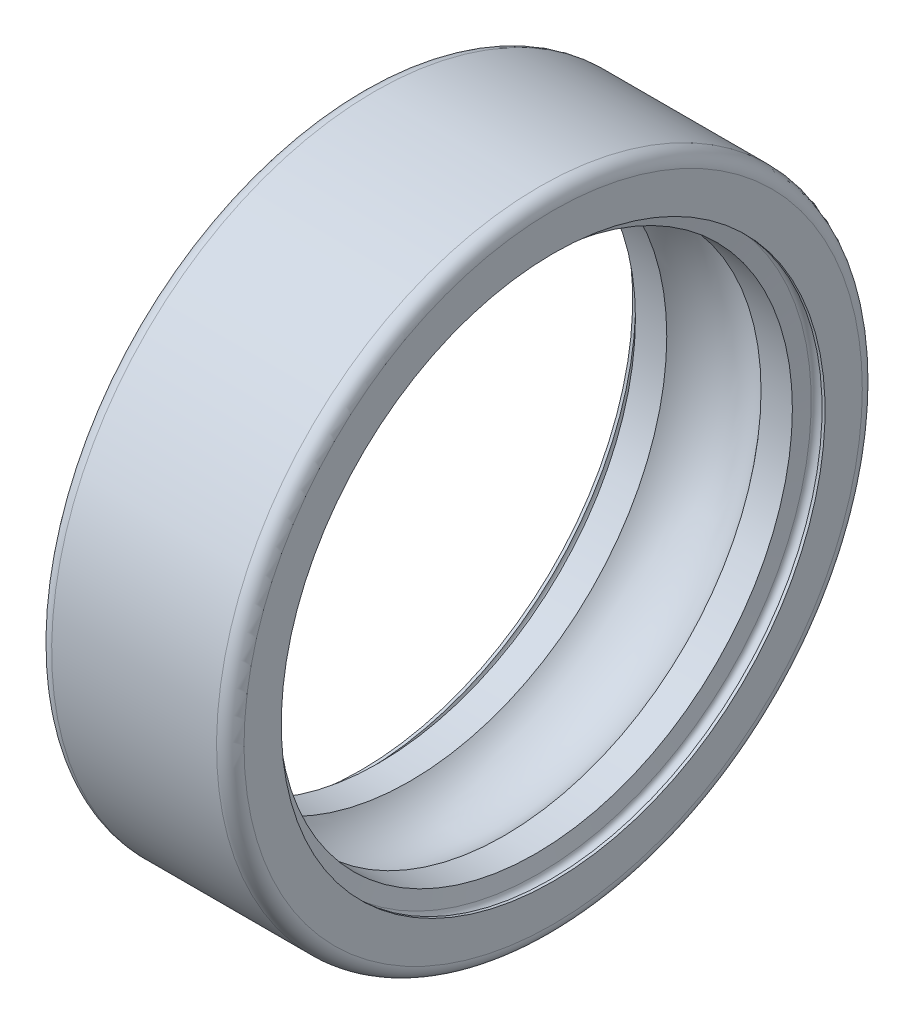
ISO-10303-21;
HEADER;
FILE_DESCRIPTION(('STEP AP214'),'2;1');
FILE_NAME('part.step','',(''),(''),'','','');
FILE_SCHEMA(('AUTOMOTIVE_DESIGN { 1 0 10303 214 1 1 1 1 }'));
ENDSEC;
DATA;
#1=APPLICATION_CONTEXT('core data for automotive mechanical design processes');
#2=APPLICATION_PROTOCOL_DEFINITION('international standard','automotive_design',2000,#1);
#3=PRODUCT_CONTEXT('',#1,'mechanical');
#4=PRODUCT('Part','Part','',(#3));
#5=PRODUCT_RELATED_PRODUCT_CATEGORY('part','',(#4));
#6=PRODUCT_DEFINITION_FORMATION('','',#4);
#7=PRODUCT_DEFINITION_CONTEXT('part definition',#1,'design');
#8=PRODUCT_DEFINITION('design','',#6,#7);
#9=PRODUCT_DEFINITION_SHAPE('','',#8);
#10=(LENGTH_UNIT() NAMED_UNIT(*) SI_UNIT(.MILLI.,.METRE.));
#11=(NAMED_UNIT(*) PLANE_ANGLE_UNIT() SI_UNIT($,.RADIAN.));
#12=(NAMED_UNIT(*) SI_UNIT($,.STERADIAN.) SOLID_ANGLE_UNIT());
#13=UNCERTAINTY_MEASURE_WITH_UNIT(LENGTH_MEASURE(1.E-05),#10,'distance_accuracy_value','');
#14=(GEOMETRIC_REPRESENTATION_CONTEXT(3) GLOBAL_UNCERTAINTY_ASSIGNED_CONTEXT((#13)) GLOBAL_UNIT_ASSIGNED_CONTEXT((#10,
#11,#12)) REPRESENTATION_CONTEXT('',''));
#15=CARTESIAN_POINT('',(0.,0.,0.));
#16=DIRECTION('',(0.,0.,1.));
#17=DIRECTION('',(1.,0.,0.));
#18=AXIS2_PLACEMENT_3D('',#15,#16,#17);
#19=CARTESIAN_POINT('',(13.346,0.,0.));
#20=DIRECTION('',(1.,0.,0.));
#21=DIRECTION('',(0.,0.,-1.));
#22=AXIS2_PLACEMENT_3D('',#19,#20,#21);
#23=TOROIDAL_SURFACE('',#22,19.79,0.436);
#24=CARTESIAN_POINT('',(13.782,0.,0.));
#25=DIRECTION('',(1.,0.,0.));
#26=DIRECTION('',(0.,1.,0.));
#27=AXIS2_PLACEMENT_3D('',#24,#25,#26);
#28=CIRCLE('',#27,19.79);
#29=CARTESIAN_POINT('',(13.782,19.79,0.));
#30=VERTEX_POINT('',#29);
#31=EDGE_CURVE('E11',#30,#30,#28,.T.);
#32=ORIENTED_EDGE('',*,*,#31,.T.);
#33=EDGE_LOOP('',(#32));
#34=FACE_BOUND('',#33,.T.);
#35=CARTESIAN_POINT('',(12.9166238196867,0.,0.));
#36=DIRECTION('',(1.,0.,0.));
#37=DIRECTION('',(0.,1.,0.));
#38=AXIS2_PLACEMENT_3D('',#35,#36,#37);
#39=CIRCLE('',#38,19.8657106054628);
#40=CARTESIAN_POINT('',(12.9166238196867,19.8657106054628,0.));
#41=VERTEX_POINT('',#40);
#42=EDGE_CURVE('E20',#41,#41,#39,.T.);
#43=ORIENTED_EDGE('',*,*,#42,.F.);
#44=EDGE_LOOP('',(#43));
#45=FACE_BOUND('',#44,.T.);
#46=ADVANCED_FACE('F16',(#34,#45),#23,.F.);
#47=CARTESIAN_POINT('',(13.891,0.,0.));
#48=DIRECTION('',(-1.,0.,0.));
#49=DIRECTION('',(0.,1.,0.));
#50=AXIS2_PLACEMENT_3D('',#47,#48,#49);
#51=CYLINDRICAL_SURFACE('',#50,19.79);
#52=CARTESIAN_POINT('',(14.,0.,0.));
#53=DIRECTION('',(1.,0.,0.));
#54=DIRECTION('',(0.,1.,0.));
#55=AXIS2_PLACEMENT_3D('',#52,#53,#54);
#56=CIRCLE('',#55,19.79);
#57=CARTESIAN_POINT('',(14.,19.79,0.));
#58=VERTEX_POINT('',#57);
#59=EDGE_CURVE('E27',#58,#58,#56,.T.);
#60=ORIENTED_EDGE('',*,*,#59,.T.);
#61=EDGE_LOOP('',(#60));
#62=FACE_BOUND('',#61,.T.);
#63=ORIENTED_EDGE('',*,*,#31,.F.);
#64=EDGE_LOOP('',(#63));
#65=FACE_BOUND('',#64,.T.);
#66=ADVANCED_FACE('F124',(#62,#65),#51,.F.);
#67=CARTESIAN_POINT('',(14.,21.145,0.));
#68=DIRECTION('',(1.,0.,0.));
#69=DIRECTION('',(0.,1.,0.));
#70=AXIS2_PLACEMENT_3D('',#67,#68,#69);
#71=PLANE('',#70);
#72=CARTESIAN_POINT('',(14.,0.,0.));
#73=DIRECTION('',(1.,0.,0.));
#74=DIRECTION('',(0.,1.,0.));
#75=AXIS2_PLACEMENT_3D('',#72,#73,#74);
#76=CIRCLE('',#75,22.5);
#77=CARTESIAN_POINT('',(14.,22.5,0.));
#78=VERTEX_POINT('',#77);
#79=EDGE_CURVE('E87',#78,#78,#76,.T.);
#80=ORIENTED_EDGE('',*,*,#79,.T.);
#81=EDGE_LOOP('',(#80));
#82=FACE_BOUND('',#81,.T.);
#83=ORIENTED_EDGE('',*,*,#59,.F.);
#84=EDGE_LOOP('',(#83));
#85=FACE_BOUND('',#84,.T.);
#86=ADVANCED_FACE('F128',(#82,#85),#71,.T.);
#87=CARTESIAN_POINT('',(13.,0.,0.));
#88=DIRECTION('',(1.,0.,0.));
#89=DIRECTION('',(0.,0.,-1.));
#90=AXIS2_PLACEMENT_3D('',#87,#88,#89);
#91=TOROIDAL_SURFACE('',#90,22.5,1.);
#92=CARTESIAN_POINT('',(13.,0.,0.));
#93=DIRECTION('',(1.,0.,0.));
#94=DIRECTION('',(0.,1.,0.));
#95=AXIS2_PLACEMENT_3D('',#92,#93,#94);
#96=CIRCLE('',#95,23.5);
#97=CARTESIAN_POINT('',(13.,23.5,0.));
#98=VERTEX_POINT('',#97);
#99=EDGE_CURVE('E84',#98,#98,#96,.T.);
#100=ORIENTED_EDGE('',*,*,#99,.T.);
#101=EDGE_LOOP('',(#100));
#102=FACE_BOUND('',#101,.T.);
#103=ORIENTED_EDGE('',*,*,#79,.F.);
#104=EDGE_LOOP('',(#103));
#105=FACE_BOUND('',#104,.T.);
#106=ADVANCED_FACE('F136',(#102,#105),#91,.T.);
#107=CARTESIAN_POINT('',(7.,0.,0.));
#108=DIRECTION('',(-1.,0.,0.));
#109=DIRECTION('',(0.,1.,0.));
#110=AXIS2_PLACEMENT_3D('',#107,#108,#109);
#111=CYLINDRICAL_SURFACE('',#110,23.5);
#112=CARTESIAN_POINT('',(1.,0.,0.));
#113=DIRECTION('',(1.,0.,0.));
#114=DIRECTION('',(0.,1.,0.));
#115=AXIS2_PLACEMENT_3D('',#112,#113,#114);
#116=CIRCLE('',#115,23.5);
#117=CARTESIAN_POINT('',(1.,23.5,0.));
#118=VERTEX_POINT('',#117);
#119=EDGE_CURVE('E88',#118,#118,#116,.T.);
#120=ORIENTED_EDGE('',*,*,#119,.T.);
#121=EDGE_LOOP('',(#120));
#122=FACE_BOUND('',#121,.T.);
#123=ORIENTED_EDGE('',*,*,#99,.F.);
#124=EDGE_LOOP('',(#123));
#125=FACE_BOUND('',#124,.T.);
#126=ADVANCED_FACE('F133',(#122,#125),#111,.T.);
#127=CARTESIAN_POINT('',(1.,0.,0.));
#128=DIRECTION('',(1.,0.,0.));
#129=DIRECTION('',(0.,0.,-1.));
#130=AXIS2_PLACEMENT_3D('',#127,#128,#129);
#131=TOROIDAL_SURFACE('',#130,22.5,1.);
#132=CARTESIAN_POINT('',(0.,0.,0.));
#133=DIRECTION('',(1.,0.,0.));
#134=DIRECTION('',(0.,1.,0.));
#135=AXIS2_PLACEMENT_3D('',#132,#133,#134);
#136=CIRCLE('',#135,22.5);
#137=CARTESIAN_POINT('',(0.,22.5,0.));
#138=VERTEX_POINT('',#137);
#139=EDGE_CURVE('E96',#138,#138,#136,.T.);
#140=ORIENTED_EDGE('',*,*,#139,.T.);
#141=EDGE_LOOP('',(#140));
#142=FACE_BOUND('',#141,.T.);
#143=ORIENTED_EDGE('',*,*,#119,.F.);
#144=EDGE_LOOP('',(#143));
#145=FACE_BOUND('',#144,.T.);
#146=ADVANCED_FACE('F18',(#142,#145),#131,.T.);
#147=CARTESIAN_POINT('',(0.,21.145,0.));
#148=DIRECTION('',(-1.,0.,0.));
#149=DIRECTION('',(0.,-1.,0.));
#150=AXIS2_PLACEMENT_3D('',#147,#148,#149);
#151=PLANE('',#150);
#152=CARTESIAN_POINT('',(0.,0.,0.));
#153=DIRECTION('',(1.,0.,0.));
#154=DIRECTION('',(0.,1.,0.));
#155=AXIS2_PLACEMENT_3D('',#152,#153,#154);
#156=CIRCLE('',#155,19.79);
#157=CARTESIAN_POINT('',(0.,19.79,0.));
#158=VERTEX_POINT('',#157);
#159=EDGE_CURVE('E99',#158,#158,#156,.T.);
#160=ORIENTED_EDGE('',*,*,#159,.T.);
#161=EDGE_LOOP('',(#160));
#162=FACE_BOUND('',#161,.T.);
#163=ORIENTED_EDGE('',*,*,#139,.F.);
#164=EDGE_LOOP('',(#163));
#165=FACE_BOUND('',#164,.T.);
#166=ADVANCED_FACE('F142',(#162,#165),#151,.T.);
#167=CARTESIAN_POINT('',(0.109,0.,0.));
#168=DIRECTION('',(-1.,0.,0.));
#169=DIRECTION('',(0.,1.,0.));
#170=AXIS2_PLACEMENT_3D('',#167,#168,#169);
#171=CYLINDRICAL_SURFACE('',#170,19.79);
#172=CARTESIAN_POINT('',(0.218,0.,0.));
#173=DIRECTION('',(1.,0.,0.));
#174=DIRECTION('',(0.,1.,0.));
#175=AXIS2_PLACEMENT_3D('',#172,#173,#174);
#176=CIRCLE('',#175,19.79);
#177=CARTESIAN_POINT('',(0.218,19.79,0.));
#178=VERTEX_POINT('',#177);
#179=EDGE_CURVE('E91',#178,#178,#176,.T.);
#180=ORIENTED_EDGE('',*,*,#179,.T.);
#181=EDGE_LOOP('',(#180));
#182=FACE_BOUND('',#181,.T.);
#183=ORIENTED_EDGE('',*,*,#159,.F.);
#184=EDGE_LOOP('',(#183));
#185=FACE_BOUND('',#184,.T.);
#186=ADVANCED_FACE('F138',(#182,#185),#171,.F.);
#187=CARTESIAN_POINT('',(0.654,0.,0.));
#188=DIRECTION('',(1.,0.,0.));
#189=DIRECTION('',(0.,0.,-1.));
#190=AXIS2_PLACEMENT_3D('',#187,#188,#189);
#191=TOROIDAL_SURFACE('',#190,19.79,0.436);
#192=CARTESIAN_POINT('',(1.08337618031332,0.,0.));
#193=DIRECTION('',(1.,0.,0.));
#194=DIRECTION('',(0.,1.,0.));
#195=AXIS2_PLACEMENT_3D('',#192,#193,#194);
#196=CIRCLE('',#195,19.8657106054628);
#197=CARTESIAN_POINT('',(1.08337618031332,19.8657106054628,0.));
#198=VERTEX_POINT('',#197);
#199=EDGE_CURVE('E89',#198,#198,#196,.T.);
#200=ORIENTED_EDGE('',*,*,#199,.T.);
#201=EDGE_LOOP('',(#200));
#202=FACE_BOUND('',#201,.T.);
#203=ORIENTED_EDGE('',*,*,#179,.F.);
#204=EDGE_LOOP('',(#203));
#205=FACE_BOUND('',#204,.T.);
#206=ADVANCED_FACE('F141',(#202,#205),#191,.F.);
#207=CARTESIAN_POINT('',(1.18614929603387,0.,0.));
#208=DIRECTION('',(-1.,0.,0.));
#209=DIRECTION('',(0.,1.,0.));
#210=AXIS2_PLACEMENT_3D('',#207,#208,#209);
#211=CONICAL_SURFACE('',#210,19.2828553027314,1.39626340159546);
#212=CARTESIAN_POINT('',(1.28892241175441,0.,0.));
#213=DIRECTION('',(1.,0.,0.));
#214=DIRECTION('',(0.,1.,0.));
#215=AXIS2_PLACEMENT_3D('',#212,#213,#214);
#216=CIRCLE('',#215,18.7);
#217=CARTESIAN_POINT('',(1.28892241175441,18.7,0.));
#218=VERTEX_POINT('',#217);
#219=EDGE_CURVE('E79',#218,#218,#216,.T.);
#220=ORIENTED_EDGE('',*,*,#219,.T.);
#221=EDGE_LOOP('',(#220));
#222=FACE_BOUND('',#221,.T.);
#223=ORIENTED_EDGE('',*,*,#199,.F.);
#224=EDGE_LOOP('',(#223));
#225=FACE_BOUND('',#224,.T.);
#226=ADVANCED_FACE('F147',(#222,#225),#211,.F.);
#227=CARTESIAN_POINT('',(2.42926513472382,0.,0.));
#228=DIRECTION('',(-1.,0.,0.));
#229=DIRECTION('',(0.,1.,0.));
#230=AXIS2_PLACEMENT_3D('',#227,#228,#229);
#231=CYLINDRICAL_SURFACE('',#230,18.7);
#232=CARTESIAN_POINT('',(3.56960785769323,0.,0.));
#233=DIRECTION('',(1.,0.,0.));
#234=DIRECTION('',(0.,1.,0.));
#235=AXIS2_PLACEMENT_3D('',#232,#233,#234);
#236=CIRCLE('',#235,18.7);
#237=CARTESIAN_POINT('',(3.56960785769323,18.7,0.));
#238=VERTEX_POINT('',#237);
#239=EDGE_CURVE('E74',#238,#238,#236,.T.);
#240=ORIENTED_EDGE('',*,*,#239,.T.);
#241=EDGE_LOOP('',(#240));
#242=FACE_BOUND('',#241,.T.);
#243=ORIENTED_EDGE('',*,*,#219,.F.);
#244=EDGE_LOOP('',(#243));
#245=FACE_BOUND('',#244,.T.);
#246=ADVANCED_FACE('F144',(#242,#245),#231,.F.);
#247=CARTESIAN_POINT('',(7.,0.,0.));
#248=DIRECTION('',(1.,0.,0.));
#249=DIRECTION('',(0.,0.,-1.));
#250=AXIS2_PLACEMENT_3D('',#247,#248,#249);
#251=TOROIDAL_SURFACE('',#250,16.,4.3655);
#252=CARTESIAN_POINT('',(10.4303921423068,0.,0.));
#253=DIRECTION('',(1.,0.,0.));
#254=DIRECTION('',(0.,1.,0.));
#255=AXIS2_PLACEMENT_3D('',#252,#253,#254);
#256=CIRCLE('',#255,18.7);
#257=CARTESIAN_POINT('',(10.4303921423068,18.7,0.));
#258=VERTEX_POINT('',#257);
#259=EDGE_CURVE('E69',#258,#258,#256,.T.);
#260=ORIENTED_EDGE('',*,*,#259,.T.);
#261=EDGE_LOOP('',(#260));
#262=FACE_BOUND('',#261,.T.);
#263=ORIENTED_EDGE('',*,*,#239,.F.);
#264=EDGE_LOOP('',(#263));
#265=FACE_BOUND('',#264,.T.);
#266=ADVANCED_FACE('F70',(#262,#265),#251,.F.);
#267=CARTESIAN_POINT('',(11.5707348652762,0.,0.));
#268=DIRECTION('',(-1.,0.,0.));
#269=DIRECTION('',(0.,1.,0.));
#270=AXIS2_PLACEMENT_3D('',#267,#268,#269);
#271=CYLINDRICAL_SURFACE('',#270,18.7);
#272=CARTESIAN_POINT('',(12.7110775882456,0.,0.));
#273=DIRECTION('',(1.,0.,0.));
#274=DIRECTION('',(0.,1.,0.));
#275=AXIS2_PLACEMENT_3D('',#272,#273,#274);
#276=CIRCLE('',#275,18.7);
#277=CARTESIAN_POINT('',(12.7110775882456,18.7,0.));
#278=VERTEX_POINT('',#277);
#279=EDGE_CURVE('E82',#278,#278,#276,.T.);
#280=ORIENTED_EDGE('',*,*,#279,.T.);
#281=EDGE_LOOP('',(#280));
#282=FACE_BOUND('',#281,.T.);
#283=ORIENTED_EDGE('',*,*,#259,.F.);
#284=EDGE_LOOP('',(#283));
#285=FACE_BOUND('',#284,.T.);
#286=ADVANCED_FACE('F111',(#282,#285),#271,.F.);
#287=CARTESIAN_POINT('',(12.8138507039661,0.,0.));
#288=DIRECTION('',(1.,0.,0.));
#289=DIRECTION('',(0.,1.,0.));
#290=AXIS2_PLACEMENT_3D('',#287,#288,#289);
#291=CONICAL_SURFACE('',#290,19.2828553027314,1.39626340159546);
#292=ORIENTED_EDGE('',*,*,#42,.T.);
#293=EDGE_LOOP('',(#292));
#294=FACE_BOUND('',#293,.T.);
#295=ORIENTED_EDGE('',*,*,#279,.F.);
#296=EDGE_LOOP('',(#295));
#297=FACE_BOUND('',#296,.T.);
#298=ADVANCED_FACE('F113',(#294,#297),#291,.F.);
#299=CLOSED_SHELL('',(#46,#66,#86,#106,#126,#146,#166,#186,#206,#226,#246,#266,#286,#298));
#300=MANIFOLD_SOLID_BREP('B1',#299);
#301=ADVANCED_BREP_SHAPE_REPRESENTATION('',(#18,#300),#14);
#302=SHAPE_DEFINITION_REPRESENTATION(#9,#301);
ENDSEC;
END-ISO-10303-21;
